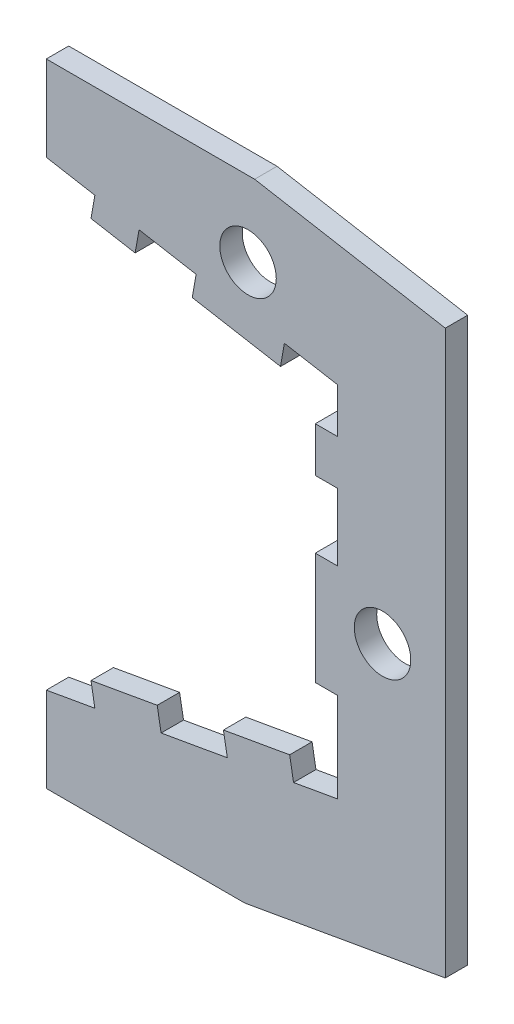
ISO-10303-21;
HEADER;
FILE_DESCRIPTION(('STEP AP214'),'2;1');
FILE_NAME('part.step','',(''),(''),'','','');
FILE_SCHEMA(('AUTOMOTIVE_DESIGN { 1 0 10303 214 1 1 1 1 }'));
ENDSEC;
DATA;
#1=APPLICATION_CONTEXT('core data for automotive mechanical design processes');
#2=APPLICATION_PROTOCOL_DEFINITION('international standard','automotive_design',2000,#1);
#3=PRODUCT_CONTEXT('',#1,'mechanical');
#4=PRODUCT('Part','Part','',(#3));
#5=PRODUCT_RELATED_PRODUCT_CATEGORY('part','',(#4));
#6=PRODUCT_DEFINITION_FORMATION('','',#4);
#7=PRODUCT_DEFINITION_CONTEXT('part definition',#1,'design');
#8=PRODUCT_DEFINITION('design','',#6,#7);
#9=PRODUCT_DEFINITION_SHAPE('','',#8);
#10=(LENGTH_UNIT() NAMED_UNIT(*) SI_UNIT(.MILLI.,.METRE.));
#11=(NAMED_UNIT(*) PLANE_ANGLE_UNIT() SI_UNIT($,.RADIAN.));
#12=(NAMED_UNIT(*) SI_UNIT($,.STERADIAN.) SOLID_ANGLE_UNIT());
#13=UNCERTAINTY_MEASURE_WITH_UNIT(LENGTH_MEASURE(1.E-05),#10,'distance_accuracy_value','');
#14=(GEOMETRIC_REPRESENTATION_CONTEXT(3) GLOBAL_UNCERTAINTY_ASSIGNED_CONTEXT((#13)) GLOBAL_UNIT_ASSIGNED_CONTEXT((#10,
#11,#12)) REPRESENTATION_CONTEXT('',''));
#15=CARTESIAN_POINT('',(0.,0.,0.));
#16=DIRECTION('',(0.,0.,1.));
#17=DIRECTION('',(1.,0.,0.));
#18=AXIS2_PLACEMENT_3D('',#15,#16,#17);
#19=CARTESIAN_POINT('',(-65.,51.4612537460498,5.));
#20=DIRECTION('',(0.173648177666924,0.984807753012209,0.));
#21=DIRECTION('',(-0.984807753012209,0.173648177666924,0.));
#22=AXIS2_PLACEMENT_3D('',#19,#20,#21);
#23=PLANE('',#22);
#24=DIRECTION('',(0.984807753012209,-0.173648177666924,0.));
#25=VECTOR('',#24,1.);
#26=CARTESIAN_POINT('',(-65.,51.4612537460498,5.));
#27=LINE('',#26,#25);
#28=CARTESIAN_POINT('',(-44.3163488855494,47.8141679950116,5.));
#29=VERTEX_POINT('',#28);
#30=CARTESIAN_POINT('',(-31.5845593067913,45.5692099795737,5.));
#31=VERTEX_POINT('',#30);
#32=EDGE_CURVE('E424',#29,#31,#27,.T.);
#33=ORIENTED_EDGE('',*,*,#32,.F.);
#34=DIRECTION('',(0.,0.,1.));
#35=VECTOR('',#34,1.);
#36=CARTESIAN_POINT('',(-44.3163488855494,47.8141679950116,0.));
#37=LINE('',#36,#35);
#38=CARTESIAN_POINT('',(-44.3163488855494,47.8141679950116,0.));
#39=VERTEX_POINT('',#38);
#40=EDGE_CURVE('E474',#39,#29,#37,.T.);
#41=ORIENTED_EDGE('',*,*,#40,.F.);
#42=DIRECTION('',(0.984807753012209,-0.173648177666924,0.));
#43=VECTOR('',#42,1.);
#44=CARTESIAN_POINT('',(-65.,51.4612537460498,0.));
#45=LINE('',#44,#43);
#46=CARTESIAN_POINT('',(-31.5845593067913,45.5692099795737,0.));
#47=VERTEX_POINT('',#46);
#48=EDGE_CURVE('E284',#39,#47,#45,.T.);
#49=ORIENTED_EDGE('',*,*,#48,.T.);
#50=DIRECTION('',(0.,0.,1.));
#51=VECTOR('',#50,1.);
#52=CARTESIAN_POINT('',(-31.5845593067913,45.5692099795737,0.));
#53=LINE('',#52,#51);
#54=EDGE_CURVE('E380',#47,#31,#53,.T.);
#55=ORIENTED_EDGE('',*,*,#54,.T.);
#56=EDGE_LOOP('',(#33,#41,#49,#55));
#57=FACE_BOUND('',#56,.T.);
#58=ADVANCED_FACE('F33',(#57),#23,.F.);
#59=CARTESIAN_POINT('',(-65.,-51.4612537460505,5.));
#60=DIRECTION('',(0.173648177666934,-0.984807753012207,0.));
#61=DIRECTION('',(0.984807753012207,0.173648177666934,0.));
#62=AXIS2_PLACEMENT_3D('',#59,#60,#61);
#63=PLANE('',#62);
#64=DIRECTION('',(-0.984807753012207,-0.173648177666934,0.));
#65=VECTOR('',#64,1.);
#66=CARTESIAN_POINT('',(-65.,-51.4612537460505,5.));
#67=LINE('',#66,#65);
#68=CARTESIAN_POINT('',(-54.1644264156714,-49.5506497716814,5.));
#69=VERTEX_POINT('',#68);
#70=CARTESIAN_POINT('',(-65.,-51.4612537460505,5.));
#71=VERTEX_POINT('',#70);
#72=EDGE_CURVE('E425',#69,#71,#67,.T.);
#73=ORIENTED_EDGE('',*,*,#72,.F.);
#74=DIRECTION('',(0.,0.,1.));
#75=VECTOR('',#74,1.);
#76=CARTESIAN_POINT('',(-54.1644264156714,-49.5506497716814,0.));
#77=LINE('',#76,#75);
#78=CARTESIAN_POINT('',(-54.1644264156714,-49.5506497716814,0.));
#79=VERTEX_POINT('',#78);
#80=EDGE_CURVE('E496',#79,#69,#77,.T.);
#81=ORIENTED_EDGE('',*,*,#80,.F.);
#82=DIRECTION('',(-0.984807753012207,-0.173648177666934,0.));
#83=VECTOR('',#82,1.);
#84=CARTESIAN_POINT('',(-65.,-51.4612537460505,0.));
#85=LINE('',#84,#83);
#86=CARTESIAN_POINT('',(-65.,-51.4612537460505,0.));
#87=VERTEX_POINT('',#86);
#88=EDGE_CURVE('E297',#79,#87,#85,.T.);
#89=ORIENTED_EDGE('',*,*,#88,.T.);
#90=DIRECTION('',(0.,0.,-1.));
#91=VECTOR('',#90,1.);
#92=CARTESIAN_POINT('',(-65.,-51.4612537460505,5.));
#93=LINE('',#92,#91);
#94=EDGE_CURVE('E306',#71,#87,#93,.T.);
#95=ORIENTED_EDGE('',*,*,#94,.F.);
#96=EDGE_LOOP('',(#73,#81,#89,#95));
#97=FACE_BOUND('',#96,.T.);
#98=ADVANCED_FACE('F445',(#97),#63,.F.);
#99=CARTESIAN_POINT('',(0.,-40.,0.));
#100=VERTEX_POINT('',#99);
#101=CARTESIAN_POINT('',(-9.84807753012207,-41.7364817766693,0.));
#102=VERTEX_POINT('',#101);
#103=EDGE_CURVE('E299',#100,#102,#85,.T.);
#104=ORIENTED_EDGE('',*,*,#103,.T.);
#105=DIRECTION('',(0.,0.,1.));
#106=VECTOR('',#105,1.);
#107=CARTESIAN_POINT('',(-9.84807753012207,-41.7364817766693,0.));
#108=LINE('',#107,#106);
#109=CARTESIAN_POINT('',(-9.84807753012207,-41.7364817766693,5.));
#110=VERTEX_POINT('',#109);
#111=EDGE_CURVE('E347',#102,#110,#108,.T.);
#112=ORIENTED_EDGE('',*,*,#111,.T.);
#113=CARTESIAN_POINT('',(0.,-40.,5.));
#114=VERTEX_POINT('',#113);
#115=EDGE_CURVE('E427',#114,#110,#67,.T.);
#116=ORIENTED_EDGE('',*,*,#115,.F.);
#117=DIRECTION('',(0.,0.,-1.));
#118=VECTOR('',#117,1.);
#119=CARTESIAN_POINT('',(0.,-40.,5.));
#120=LINE('',#119,#118);
#121=EDGE_CURVE('E309',#114,#100,#120,.T.);
#122=ORIENTED_EDGE('',*,*,#121,.T.);
#123=EDGE_LOOP('',(#104,#112,#116,#122));
#124=FACE_BOUND('',#123,.T.);
#125=ADVANCED_FACE('F630',(#124),#63,.F.);
#126=CARTESIAN_POINT('',(0.,40.,5.));
#127=DIRECTION('',(1.,0.,0.));
#128=DIRECTION('',(0.,0.,-1.));
#129=AXIS2_PLACEMENT_3D('',#126,#127,#128);
#130=PLANE('',#129);
#131=DIRECTION('',(0.,-1.,0.));
#132=VECTOR('',#131,1.);
#133=CARTESIAN_POINT('',(0.,40.,5.));
#134=LINE('',#133,#132);
#135=CARTESIAN_POINT('',(0.,20.,5.));
#136=VERTEX_POINT('',#135);
#137=CARTESIAN_POINT('',(0.,5.,5.));
#138=VERTEX_POINT('',#137);
#139=EDGE_CURVE('E426',#136,#138,#134,.T.);
#140=ORIENTED_EDGE('',*,*,#139,.F.);
#141=DIRECTION('',(0.,0.,1.));
#142=VECTOR('',#141,1.);
#143=CARTESIAN_POINT('',(0.,20.,0.));
#144=LINE('',#143,#142);
#145=CARTESIAN_POINT('',(0.,20.,0.));
#146=VERTEX_POINT('',#145);
#147=EDGE_CURVE('E350',#146,#136,#144,.T.);
#148=ORIENTED_EDGE('',*,*,#147,.F.);
#149=DIRECTION('',(0.,-1.,0.));
#150=VECTOR('',#149,1.);
#151=CARTESIAN_POINT('',(0.,40.,0.));
#152=LINE('',#151,#150);
#153=CARTESIAN_POINT('',(0.,5.,0.));
#154=VERTEX_POINT('',#153);
#155=EDGE_CURVE('E298',#146,#154,#152,.T.);
#156=ORIENTED_EDGE('',*,*,#155,.T.);
#157=DIRECTION('',(0.,0.,1.));
#158=VECTOR('',#157,1.);
#159=CARTESIAN_POINT('',(0.,5.,0.));
#160=LINE('',#159,#158);
#161=EDGE_CURVE('E394',#154,#138,#160,.T.);
#162=ORIENTED_EDGE('',*,*,#161,.T.);
#163=EDGE_LOOP('',(#140,#148,#156,#162));
#164=FACE_BOUND('',#163,.T.);
#165=ADVANCED_FACE('F635',(#164),#130,.F.);
#166=CARTESIAN_POINT('',(-11.8884042465471,42.0962464262353,5.));
#167=VERTEX_POINT('',#166);
#168=CARTESIAN_POINT('',(0.,40.,5.));
#169=VERTEX_POINT('',#168);
#170=EDGE_CURVE('E419',#167,#169,#27,.T.);
#171=ORIENTED_EDGE('',*,*,#170,.F.);
#172=DIRECTION('',(0.,0.,1.));
#173=VECTOR('',#172,1.);
#174=CARTESIAN_POINT('',(-11.8884042465471,42.0962464262353,0.));
#175=LINE('',#174,#173);
#176=CARTESIAN_POINT('',(-11.8884042465471,42.0962464262353,0.));
#177=VERTEX_POINT('',#176);
#178=EDGE_CURVE('E368',#177,#167,#175,.T.);
#179=ORIENTED_EDGE('',*,*,#178,.F.);
#180=CARTESIAN_POINT('',(0.,40.,0.));
#181=VERTEX_POINT('',#180);
#182=EDGE_CURVE('E281',#177,#181,#45,.T.);
#183=ORIENTED_EDGE('',*,*,#182,.T.);
#184=DIRECTION('',(0.,0.,-1.));
#185=VECTOR('',#184,1.);
#186=CARTESIAN_POINT('',(0.,40.,5.));
#187=LINE('',#186,#185);
#188=EDGE_CURVE('E41',#169,#181,#187,.T.);
#189=ORIENTED_EDGE('',*,*,#188,.F.);
#190=EDGE_LOOP('',(#171,#179,#183,#189));
#191=FACE_BOUND('',#190,.T.);
#192=ADVANCED_FACE('F604',(#191),#23,.F.);
#193=CARTESIAN_POINT('',(0.,-20.,5.));
#194=VERTEX_POINT('',#193);
#195=EDGE_CURVE('E423',#194,#114,#134,.T.);
#196=ORIENTED_EDGE('',*,*,#195,.F.);
#197=DIRECTION('',(0.,0.,1.));
#198=VECTOR('',#197,1.);
#199=CARTESIAN_POINT('',(0.,-20.,0.));
#200=LINE('',#199,#198);
#201=CARTESIAN_POINT('',(0.,-20.,0.));
#202=VERTEX_POINT('',#201);
#203=EDGE_CURVE('E401',#202,#194,#200,.T.);
#204=ORIENTED_EDGE('',*,*,#203,.F.);
#205=EDGE_CURVE('E293',#202,#100,#152,.T.);
#206=ORIENTED_EDGE('',*,*,#205,.T.);
#207=ORIENTED_EDGE('',*,*,#121,.F.);
#208=EDGE_LOOP('',(#196,#204,#206,#207));
#209=FACE_BOUND('',#208,.T.);
#210=ADVANCED_FACE('F634',(#209),#130,.F.);
#211=CARTESIAN_POINT('',(0.,0.,5.));
#212=DIRECTION('',(0.,0.,1.));
#213=DIRECTION('',(1.,0.,0.));
#214=AXIS2_PLACEMENT_3D('',#211,#212,#213);
#215=PLANE('',#214);
#216=DIRECTION('',(-1.,0.,0.));
#217=VECTOR('',#216,1.);
#218=CARTESIAN_POINT('',(-20.713388405461,-70.4612537460498,5.));
#219=LINE('',#218,#217);
#220=CARTESIAN_POINT('',(-20.713388405461,-70.4612537460498,5.));
#221=VERTEX_POINT('',#220);
#222=CARTESIAN_POINT('',(-65.,-70.4612537460498,5.));
#223=VERTEX_POINT('',#222);
#224=EDGE_CURVE('E48',#221,#223,#219,.T.);
#225=ORIENTED_EDGE('',*,*,#224,.F.);
#226=DIRECTION('',(-0.984807753012207,-0.173648177666934,0.));
#227=VECTOR('',#226,1.);
#228=CARTESIAN_POINT('',(24.,-62.5770769712698,5.));
#229=LINE('',#228,#227);
#230=CARTESIAN_POINT('',(24.,-62.5770769712698,5.));
#231=VERTEX_POINT('',#230);
#232=EDGE_CURVE('E572',#231,#221,#229,.T.);
#233=ORIENTED_EDGE('',*,*,#232,.F.);
#234=DIRECTION('',(0.,-1.,0.));
#235=VECTOR('',#234,1.);
#236=CARTESIAN_POINT('',(24.,62.9617320536433,5.));
#237=LINE('',#236,#235);
#238=CARTESIAN_POINT('',(24.,62.9617320536433,5.));
#239=VERTEX_POINT('',#238);
#240=EDGE_CURVE('E570',#239,#231,#237,.T.);
#241=ORIENTED_EDGE('',*,*,#240,.F.);
#242=DIRECTION('',(0.984807753012209,-0.173648177666927,0.));
#243=VECTOR('',#242,1.);
#244=CARTESIAN_POINT('',(-18.5319010299744,70.4612537460498,5.));
#245=LINE('',#244,#243);
#246=CARTESIAN_POINT('',(-18.5319010299744,70.4612537460498,5.));
#247=VERTEX_POINT('',#246);
#248=EDGE_CURVE('E567',#247,#239,#245,.T.);
#249=ORIENTED_EDGE('',*,*,#248,.F.);
#250=DIRECTION('',(1.,0.,0.));
#251=VECTOR('',#250,1.);
#252=CARTESIAN_POINT('',(-65.,70.4612537460498,5.));
#253=LINE('',#252,#251);
#254=CARTESIAN_POINT('',(-65.,70.4612537460498,5.));
#255=VERTEX_POINT('',#254);
#256=EDGE_CURVE('E565',#255,#247,#253,.T.);
#257=ORIENTED_EDGE('',*,*,#256,.F.);
#258=DIRECTION('',(0.,-1.,0.));
#259=VECTOR('',#258,1.);
#260=CARTESIAN_POINT('',(-65.,71.4612537460498,5.));
#261=LINE('',#260,#259);
#262=CARTESIAN_POINT('',(-65.,51.4612537460498,5.));
#263=VERTEX_POINT('',#262);
#264=EDGE_CURVE('E272',#255,#263,#261,.T.);
#265=ORIENTED_EDGE('',*,*,#264,.T.);
#266=CARTESIAN_POINT('',(-54.1644264156715,49.5506497716808,5.));
#267=VERTEX_POINT('',#266);
#268=EDGE_CURVE('E420',#263,#267,#27,.T.);
#269=ORIENTED_EDGE('',*,*,#268,.T.);
#270=DIRECTION('',(-0.173648177666924,-0.984807753012209,0.));
#271=VECTOR('',#270,1.);
#272=CARTESIAN_POINT('',(-54.1644264156715,49.5506497716808,5.));
#273=LINE('',#272,#271);
#274=CARTESIAN_POINT('',(-55.0326673040061,44.6266110066198,5.));
#275=VERTEX_POINT('',#274);
#276=EDGE_CURVE('E455',#267,#275,#273,.T.);
#277=ORIENTED_EDGE('',*,*,#276,.T.);
#278=DIRECTION('',(0.984807753012209,-0.173648177666923,0.));
#279=VECTOR('',#278,1.);
#280=CARTESIAN_POINT('',(-45.184589773884,42.8901292299505,5.));
#281=LINE('',#280,#279);
#282=CARTESIAN_POINT('',(-45.184589773884,42.8901292299505,5.));
#283=VERTEX_POINT('',#282);
#284=EDGE_CURVE('E469',#275,#283,#281,.T.);
#285=ORIENTED_EDGE('',*,*,#284,.T.);
#286=DIRECTION('',(0.173648177666924,0.984807753012209,0.));
#287=VECTOR('',#286,1.);
#288=CARTESIAN_POINT('',(-44.3163488855494,47.8141679950116,5.));
#289=LINE('',#288,#287);
#290=EDGE_CURVE('E56',#283,#29,#289,.T.);
#291=ORIENTED_EDGE('',*,*,#290,.T.);
#292=ORIENTED_EDGE('',*,*,#32,.T.);
#293=DIRECTION('',(-0.173648177666924,-0.984807753012209,0.));
#294=VECTOR('',#293,1.);
#295=CARTESIAN_POINT('',(-31.5845593067913,45.5692099795737,5.));
#296=LINE('',#295,#294);
#297=CARTESIAN_POINT('',(-32.4528001951259,40.6451712145127,5.));
#298=VERTEX_POINT('',#297);
#299=EDGE_CURVE('E370',#31,#298,#296,.T.);
#300=ORIENTED_EDGE('',*,*,#299,.T.);
#301=DIRECTION('',(0.984807753012209,-0.173648177666923,0.));
#302=VECTOR('',#301,1.);
#303=CARTESIAN_POINT('',(-12.7566451348818,37.1722076611742,5.));
#304=LINE('',#303,#302);
#305=CARTESIAN_POINT('',(-12.7566451348818,37.1722076611742,5.));
#306=VERTEX_POINT('',#305);
#307=EDGE_CURVE('E362',#298,#306,#304,.T.);
#308=ORIENTED_EDGE('',*,*,#307,.T.);
#309=DIRECTION('',(0.173648177666923,0.984807753012209,0.));
#310=VECTOR('',#309,1.);
#311=CARTESIAN_POINT('',(-11.8884042465471,42.0962464262353,5.));
#312=LINE('',#311,#310);
#313=EDGE_CURVE('E353',#306,#167,#312,.T.);
#314=ORIENTED_EDGE('',*,*,#313,.T.);
#315=ORIENTED_EDGE('',*,*,#170,.T.);
#316=CARTESIAN_POINT('',(0.,30.,5.));
#317=VERTEX_POINT('',#316);
#318=EDGE_CURVE('E319',#169,#317,#134,.T.);
#319=ORIENTED_EDGE('',*,*,#318,.T.);
#320=DIRECTION('',(-1.,0.,0.));
#321=VECTOR('',#320,1.);
#322=CARTESIAN_POINT('',(0.,30.,5.));
#323=LINE('',#322,#321);
#324=CARTESIAN_POINT('',(-5.00000000000001,30.,5.));
#325=VERTEX_POINT('',#324);
#326=EDGE_CURVE('E344',#317,#325,#323,.T.);
#327=ORIENTED_EDGE('',*,*,#326,.T.);
#328=DIRECTION('',(0.,-1.,0.));
#329=VECTOR('',#328,1.);
#330=CARTESIAN_POINT('',(-5.00000000000001,30.,5.));
#331=LINE('',#330,#329);
#332=CARTESIAN_POINT('',(-5.00000000000001,20.,5.));
#333=VERTEX_POINT('',#332);
#334=EDGE_CURVE('E336',#325,#333,#331,.T.);
#335=ORIENTED_EDGE('',*,*,#334,.T.);
#336=DIRECTION('',(1.,0.,0.));
#337=VECTOR('',#336,1.);
#338=CARTESIAN_POINT('',(0.,20.,5.));
#339=LINE('',#338,#337);
#340=EDGE_CURVE('E332',#333,#136,#339,.T.);
#341=ORIENTED_EDGE('',*,*,#340,.T.);
#342=ORIENTED_EDGE('',*,*,#139,.T.);
#343=DIRECTION('',(-1.,0.,0.));
#344=VECTOR('',#343,1.);
#345=CARTESIAN_POINT('',(0.,5.,5.));
#346=LINE('',#345,#344);
#347=CARTESIAN_POINT('',(-5.,5.,5.));
#348=VERTEX_POINT('',#347);
#349=EDGE_CURVE('E377',#138,#348,#346,.T.);
#350=ORIENTED_EDGE('',*,*,#349,.T.);
#351=DIRECTION('',(0.,-1.,0.));
#352=VECTOR('',#351,1.);
#353=CARTESIAN_POINT('',(-5.,5.,5.));
#354=LINE('',#353,#352);
#355=CARTESIAN_POINT('',(-5.,-20.,5.));
#356=VERTEX_POINT('',#355);
#357=EDGE_CURVE('E397',#348,#356,#354,.T.);
#358=ORIENTED_EDGE('',*,*,#357,.T.);
#359=DIRECTION('',(1.,0.,0.));
#360=VECTOR('',#359,1.);
#361=CARTESIAN_POINT('',(0.,-20.,5.));
#362=LINE('',#361,#360);
#363=EDGE_CURVE('E389',#356,#194,#362,.T.);
#364=ORIENTED_EDGE('',*,*,#363,.T.);
#365=ORIENTED_EDGE('',*,*,#195,.T.);
#366=ORIENTED_EDGE('',*,*,#115,.T.);
#367=DIRECTION('',(-0.173648177666935,0.984807753012207,0.));
#368=VECTOR('',#367,1.);
#369=CARTESIAN_POINT('',(-9.84807753012207,-41.7364817766693,5.));
#370=LINE('',#369,#368);
#371=CARTESIAN_POINT('',(-10.7163184184567,-36.8124430116083,5.));
#372=VERTEX_POINT('',#371);
#373=EDGE_CURVE('E504',#110,#372,#370,.T.);
#374=ORIENTED_EDGE('',*,*,#373,.T.);
#375=DIRECTION('',(-0.984807753012207,-0.173648177666934,0.));
#376=VECTOR('',#375,1.);
#377=CARTESIAN_POINT('',(-10.7163184184567,-36.8124430116083,5.));
#378=LINE('',#377,#376);
#379=CARTESIAN_POINT('',(-25.4884347136398,-39.4171656766123,5.));
#380=VERTEX_POINT('',#379);
#381=EDGE_CURVE('E521',#372,#380,#378,.T.);
#382=ORIENTED_EDGE('',*,*,#381,.T.);
#383=DIRECTION('',(0.173648177666934,-0.984807753012207,0.));
#384=VECTOR('',#383,1.);
#385=CARTESIAN_POINT('',(-24.6201938253052,-44.3412044416733,5.));
#386=LINE('',#385,#384);
#387=CARTESIAN_POINT('',(-24.6201938253052,-44.3412044416734,5.));
#388=VERTEX_POINT('',#387);
#389=EDGE_CURVE('E515',#380,#388,#386,.T.);
#390=ORIENTED_EDGE('',*,*,#389,.T.);
#391=CARTESIAN_POINT('',(-39.3923101204883,-46.9459271066774,5.));
#392=VERTEX_POINT('',#391);
#393=EDGE_CURVE('E429',#388,#392,#67,.T.);
#394=ORIENTED_EDGE('',*,*,#393,.T.);
#395=DIRECTION('',(-0.173648177666934,0.984807753012207,0.));
#396=VECTOR('',#395,1.);
#397=CARTESIAN_POINT('',(-39.3923101204883,-46.9459271066774,5.));
#398=LINE('',#397,#396);
#399=CARTESIAN_POINT('',(-40.260551008823,-42.0218883416163,5.));
#400=VERTEX_POINT('',#399);
#401=EDGE_CURVE('E498',#392,#400,#398,.T.);
#402=ORIENTED_EDGE('',*,*,#401,.T.);
#403=DIRECTION('',(-0.984807753012207,-0.173648177666934,0.));
#404=VECTOR('',#403,1.);
#405=CARTESIAN_POINT('',(-55.0326673040061,-44.6266110066203,5.));
#406=LINE('',#405,#404);
#407=CARTESIAN_POINT('',(-55.0326673040061,-44.6266110066203,5.));
#408=VERTEX_POINT('',#407);
#409=EDGE_CURVE('E490',#400,#408,#406,.T.);
#410=ORIENTED_EDGE('',*,*,#409,.T.);
#411=DIRECTION('',(0.173648177666934,-0.984807753012207,0.));
#412=VECTOR('',#411,1.);
#413=CARTESIAN_POINT('',(-54.1644264156714,-49.5506497716814,5.));
#414=LINE('',#413,#412);
#415=EDGE_CURVE('E441',#408,#69,#414,.T.);
#416=ORIENTED_EDGE('',*,*,#415,.T.);
#417=ORIENTED_EDGE('',*,*,#72,.T.);
#418=DIRECTION('',(0.,-1.,0.));
#419=VECTOR('',#418,1.);
#420=CARTESIAN_POINT('',(-65.,-51.4612537460505,5.));
#421=LINE('',#420,#419);
#422=EDGE_CURVE('E290',#71,#223,#421,.T.);
#423=ORIENTED_EDGE('',*,*,#422,.T.);
#424=EDGE_LOOP('',(#225,#233,#241,#249,#257,#265,#269,#277,#285,#291,#292,#300,#308,#314,#315,
#319,#327,#335,#341,#342,#350,#358,#364,#365,#366,#374,#382,#390,#394,#402,#410,#416,#417,#423));
#425=FACE_BOUND('',#424,.T.);
#426=CARTESIAN_POINT('',(-20.,53.6808057330266,5.));
#427=DIRECTION('',(0.,0.,1.));
#428=DIRECTION('',(1.,0.,0.));
#429=AXIS2_PLACEMENT_3D('',#426,#427,#428);
#430=CIRCLE('',#429,6.30000000000009);
#431=CARTESIAN_POINT('',(-13.6999999999999,53.6808057330266,5.));
#432=VERTEX_POINT('',#431);
#433=EDGE_CURVE('E282',#432,#432,#430,.T.);
#434=ORIENTED_EDGE('',*,*,#433,.F.);
#435=EDGE_LOOP('',(#434));
#436=FACE_BOUND('',#435,.T.);
#437=CARTESIAN_POINT('',(10.,-5.,5.));
#438=DIRECTION('',(0.,0.,1.));
#439=DIRECTION('',(-1.,0.,0.));
#440=AXIS2_PLACEMENT_3D('',#437,#438,#439);
#441=CIRCLE('',#440,6.30000000000009);
#442=CARTESIAN_POINT('',(3.69999999999992,-5.,5.));
#443=VERTEX_POINT('',#442);
#444=EDGE_CURVE('E411',#443,#443,#441,.T.);
#445=ORIENTED_EDGE('',*,*,#444,.F.);
#446=EDGE_LOOP('',(#445));
#447=FACE_BOUND('',#446,.T.);
#448=ADVANCED_FACE('F436',(#425,#436,#447),#215,.T.);
#449=CARTESIAN_POINT('',(0.,0.,0.));
#450=DIRECTION('',(0.,0.,1.));
#451=DIRECTION('',(1.,0.,0.));
#452=AXIS2_PLACEMENT_3D('',#449,#450,#451);
#453=PLANE('',#452);
#454=CARTESIAN_POINT('',(-20.,53.6808057330266,0.));
#455=DIRECTION('',(0.,0.,1.));
#456=DIRECTION('',(1.,0.,0.));
#457=AXIS2_PLACEMENT_3D('',#454,#455,#456);
#458=CIRCLE('',#457,6.30000000000009);
#459=CARTESIAN_POINT('',(-13.6999999999999,53.6808057330266,0.));
#460=VERTEX_POINT('',#459);
#461=EDGE_CURVE('E287',#460,#460,#458,.T.);
#462=ORIENTED_EDGE('',*,*,#461,.T.);
#463=EDGE_LOOP('',(#462));
#464=FACE_BOUND('',#463,.T.);
#465=DIRECTION('',(-0.984807753012207,-0.173648177666934,0.));
#466=VECTOR('',#465,1.);
#467=CARTESIAN_POINT('',(24.,-62.5770769712698,0.));
#468=LINE('',#467,#466);
#469=CARTESIAN_POINT('',(24.,-62.5770769712698,0.));
#470=VERTEX_POINT('',#469);
#471=CARTESIAN_POINT('',(-20.713388405461,-70.4612537460498,0.));
#472=VERTEX_POINT('',#471);
#473=EDGE_CURVE('E559',#470,#472,#468,.T.);
#474=ORIENTED_EDGE('',*,*,#473,.T.);
#475=DIRECTION('',(-1.,0.,0.));
#476=VECTOR('',#475,1.);
#477=CARTESIAN_POINT('',(-20.713388405461,-70.4612537460498,0.));
#478=LINE('',#477,#476);
#479=CARTESIAN_POINT('',(-65.,-70.4612537460498,0.));
#480=VERTEX_POINT('',#479);
#481=EDGE_CURVE('E273',#472,#480,#478,.T.);
#482=ORIENTED_EDGE('',*,*,#481,.T.);
#483=DIRECTION('',(0.,-1.,0.));
#484=VECTOR('',#483,1.);
#485=CARTESIAN_POINT('',(-65.,-51.4612537460505,0.));
#486=LINE('',#485,#484);
#487=EDGE_CURVE('E302',#87,#480,#486,.T.);
#488=ORIENTED_EDGE('',*,*,#487,.F.);
#489=ORIENTED_EDGE('',*,*,#88,.F.);
#490=DIRECTION('',(0.173648177666934,-0.984807753012207,0.));
#491=VECTOR('',#490,1.);
#492=CARTESIAN_POINT('',(-54.1644264156714,-49.5506497716814,0.));
#493=LINE('',#492,#491);
#494=CARTESIAN_POINT('',(-55.0326673040061,-44.6266110066203,0.));
#495=VERTEX_POINT('',#494);
#496=EDGE_CURVE('E487',#495,#79,#493,.T.);
#497=ORIENTED_EDGE('',*,*,#496,.F.);
#498=DIRECTION('',(-0.984807753012207,-0.173648177666934,0.));
#499=VECTOR('',#498,1.);
#500=CARTESIAN_POINT('',(-55.0326673040061,-44.6266110066203,0.));
#501=LINE('',#500,#499);
#502=CARTESIAN_POINT('',(-40.260551008823,-42.0218883416163,0.));
#503=VERTEX_POINT('',#502);
#504=EDGE_CURVE('E493',#503,#495,#501,.T.);
#505=ORIENTED_EDGE('',*,*,#504,.F.);
#506=DIRECTION('',(-0.173648177666934,0.984807753012207,0.));
#507=VECTOR('',#506,1.);
#508=CARTESIAN_POINT('',(-39.3923101204883,-46.9459271066774,0.));
#509=LINE('',#508,#507);
#510=CARTESIAN_POINT('',(-39.3923101204883,-46.9459271066774,0.));
#511=VERTEX_POINT('',#510);
#512=EDGE_CURVE('E489',#511,#503,#509,.T.);
#513=ORIENTED_EDGE('',*,*,#512,.F.);
#514=CARTESIAN_POINT('',(-24.6201938253052,-44.3412044416733,0.));
#515=VERTEX_POINT('',#514);
#516=EDGE_CURVE('E303',#515,#511,#85,.T.);
#517=ORIENTED_EDGE('',*,*,#516,.F.);
#518=DIRECTION('',(0.173648177666934,-0.984807753012207,0.));
#519=VECTOR('',#518,1.);
#520=CARTESIAN_POINT('',(-24.6201938253052,-44.3412044416733,0.));
#521=LINE('',#520,#519);
#522=CARTESIAN_POINT('',(-25.4884347136398,-39.4171656766123,0.));
#523=VERTEX_POINT('',#522);
#524=EDGE_CURVE('E518',#523,#515,#521,.T.);
#525=ORIENTED_EDGE('',*,*,#524,.F.);
#526=DIRECTION('',(-0.984807753012207,-0.173648177666934,0.));
#527=VECTOR('',#526,1.);
#528=CARTESIAN_POINT('',(-10.7163184184567,-36.8124430116083,0.));
#529=LINE('',#528,#527);
#530=CARTESIAN_POINT('',(-10.7163184184567,-36.8124430116083,0.));
#531=VERTEX_POINT('',#530);
#532=EDGE_CURVE('E514',#531,#523,#529,.T.);
#533=ORIENTED_EDGE('',*,*,#532,.F.);
#534=DIRECTION('',(-0.173648177666935,0.984807753012207,0.));
#535=VECTOR('',#534,1.);
#536=CARTESIAN_POINT('',(-9.84807753012207,-41.7364817766693,0.));
#537=LINE('',#536,#535);
#538=EDGE_CURVE('E511',#102,#531,#537,.T.);
#539=ORIENTED_EDGE('',*,*,#538,.F.);
#540=ORIENTED_EDGE('',*,*,#103,.F.);
#541=ORIENTED_EDGE('',*,*,#205,.F.);
#542=DIRECTION('',(1.,0.,0.));
#543=VECTOR('',#542,1.);
#544=CARTESIAN_POINT('',(0.,-20.,0.));
#545=LINE('',#544,#543);
#546=CARTESIAN_POINT('',(-5.,-20.,0.));
#547=VERTEX_POINT('',#546);
#548=EDGE_CURVE('E392',#547,#202,#545,.T.);
#549=ORIENTED_EDGE('',*,*,#548,.F.);
#550=DIRECTION('',(0.,-1.,0.));
#551=VECTOR('',#550,1.);
#552=CARTESIAN_POINT('',(-5.,5.,0.));
#553=LINE('',#552,#551);
#554=CARTESIAN_POINT('',(-5.,5.,0.));
#555=VERTEX_POINT('',#554);
#556=EDGE_CURVE('E388',#555,#547,#553,.T.);
#557=ORIENTED_EDGE('',*,*,#556,.F.);
#558=DIRECTION('',(-1.,0.,0.));
#559=VECTOR('',#558,1.);
#560=CARTESIAN_POINT('',(0.,5.,0.));
#561=LINE('',#560,#559);
#562=EDGE_CURVE('E385',#154,#555,#561,.T.);
#563=ORIENTED_EDGE('',*,*,#562,.F.);
#564=ORIENTED_EDGE('',*,*,#155,.F.);
#565=DIRECTION('',(1.,0.,0.));
#566=VECTOR('',#565,1.);
#567=CARTESIAN_POINT('',(0.,20.,0.));
#568=LINE('',#567,#566);
#569=CARTESIAN_POINT('',(-5.00000000000001,20.,0.));
#570=VERTEX_POINT('',#569);
#571=EDGE_CURVE('E334',#570,#146,#568,.T.);
#572=ORIENTED_EDGE('',*,*,#571,.F.);
#573=DIRECTION('',(0.,-1.,0.));
#574=VECTOR('',#573,1.);
#575=CARTESIAN_POINT('',(-5.00000000000001,30.,0.));
#576=LINE('',#575,#574);
#577=CARTESIAN_POINT('',(-5.00000000000001,30.,0.));
#578=VERTEX_POINT('',#577);
#579=EDGE_CURVE('E330',#578,#570,#576,.T.);
#580=ORIENTED_EDGE('',*,*,#579,.F.);
#581=DIRECTION('',(-1.,0.,0.));
#582=VECTOR('',#581,1.);
#583=CARTESIAN_POINT('',(0.,30.,0.));
#584=LINE('',#583,#582);
#585=CARTESIAN_POINT('',(0.,30.,0.));
#586=VERTEX_POINT('',#585);
#587=EDGE_CURVE('E327',#586,#578,#584,.T.);
#588=ORIENTED_EDGE('',*,*,#587,.F.);
#589=EDGE_CURVE('E294',#181,#586,#152,.T.);
#590=ORIENTED_EDGE('',*,*,#589,.F.);
#591=ORIENTED_EDGE('',*,*,#182,.F.);
#592=DIRECTION('',(0.173648177666923,0.984807753012209,0.));
#593=VECTOR('',#592,1.);
#594=CARTESIAN_POINT('',(-11.8884042465471,42.0962464262353,0.));
#595=LINE('',#594,#593);
#596=CARTESIAN_POINT('',(-12.7566451348818,37.1722076611742,0.));
#597=VERTEX_POINT('',#596);
#598=EDGE_CURVE('E359',#597,#177,#595,.T.);
#599=ORIENTED_EDGE('',*,*,#598,.F.);
#600=DIRECTION('',(0.984807753012209,-0.173648177666923,0.));
#601=VECTOR('',#600,1.);
#602=CARTESIAN_POINT('',(-12.7566451348818,37.1722076611742,0.));
#603=LINE('',#602,#601);
#604=CARTESIAN_POINT('',(-32.4528001951259,40.6451712145127,0.));
#605=VERTEX_POINT('',#604);
#606=EDGE_CURVE('E365',#605,#597,#603,.T.);
#607=ORIENTED_EDGE('',*,*,#606,.F.);
#608=DIRECTION('',(-0.173648177666924,-0.984807753012209,0.));
#609=VECTOR('',#608,1.);
#610=CARTESIAN_POINT('',(-31.5845593067913,45.5692099795737,0.));
#611=LINE('',#610,#609);
#612=EDGE_CURVE('E361',#47,#605,#611,.T.);
#613=ORIENTED_EDGE('',*,*,#612,.F.);
#614=ORIENTED_EDGE('',*,*,#48,.F.);
#615=DIRECTION('',(0.173648177666924,0.984807753012209,0.));
#616=VECTOR('',#615,1.);
#617=CARTESIAN_POINT('',(-44.3163488855494,47.8141679950116,0.));
#618=LINE('',#617,#616);
#619=CARTESIAN_POINT('',(-45.184589773884,42.8901292299505,0.));
#620=VERTEX_POINT('',#619);
#621=EDGE_CURVE('E466',#620,#39,#618,.T.);
#622=ORIENTED_EDGE('',*,*,#621,.F.);
#623=DIRECTION('',(0.984807753012209,-0.173648177666923,0.));
#624=VECTOR('',#623,1.);
#625=CARTESIAN_POINT('',(-45.184589773884,42.8901292299505,0.));
#626=LINE('',#625,#624);
#627=CARTESIAN_POINT('',(-55.0326673040061,44.6266110066198,0.));
#628=VERTEX_POINT('',#627);
#629=EDGE_CURVE('E472',#628,#620,#626,.T.);
#630=ORIENTED_EDGE('',*,*,#629,.F.);
#631=DIRECTION('',(-0.173648177666924,-0.984807753012209,0.));
#632=VECTOR('',#631,1.);
#633=CARTESIAN_POINT('',(-54.1644264156715,49.5506497716808,0.));
#634=LINE('',#633,#632);
#635=CARTESIAN_POINT('',(-54.1644264156715,49.5506497716808,0.));
#636=VERTEX_POINT('',#635);
#637=EDGE_CURVE('E468',#636,#628,#634,.T.);
#638=ORIENTED_EDGE('',*,*,#637,.F.);
#639=CARTESIAN_POINT('',(-65.,51.4612537460498,0.));
#640=VERTEX_POINT('',#639);
#641=EDGE_CURVE('E280',#640,#636,#45,.T.);
#642=ORIENTED_EDGE('',*,*,#641,.F.);
#643=DIRECTION('',(0.,-1.,0.));
#644=VECTOR('',#643,1.);
#645=CARTESIAN_POINT('',(-65.,71.4612537460498,0.));
#646=LINE('',#645,#644);
#647=CARTESIAN_POINT('',(-65.,70.4612537460498,0.));
#648=VERTEX_POINT('',#647);
#649=EDGE_CURVE('E270',#648,#640,#646,.T.);
#650=ORIENTED_EDGE('',*,*,#649,.F.);
#651=DIRECTION('',(1.,0.,0.));
#652=VECTOR('',#651,1.);
#653=CARTESIAN_POINT('',(-65.,70.4612537460498,0.));
#654=LINE('',#653,#652);
#655=CARTESIAN_POINT('',(-18.5319010299744,70.4612537460498,0.));
#656=VERTEX_POINT('',#655);
#657=EDGE_CURVE('E254',#648,#656,#654,.T.);
#658=ORIENTED_EDGE('',*,*,#657,.T.);
#659=DIRECTION('',(0.984807753012209,-0.173648177666927,0.));
#660=VECTOR('',#659,1.);
#661=CARTESIAN_POINT('',(-18.5319010299744,70.4612537460498,0.));
#662=LINE('',#661,#660);
#663=CARTESIAN_POINT('',(24.,62.9617320536433,0.));
#664=VERTEX_POINT('',#663);
#665=EDGE_CURVE('E265',#656,#664,#662,.T.);
#666=ORIENTED_EDGE('',*,*,#665,.T.);
#667=DIRECTION('',(0.,-1.,0.));
#668=VECTOR('',#667,1.);
#669=CARTESIAN_POINT('',(24.,62.9617320536433,0.));
#670=LINE('',#669,#668);
#671=EDGE_CURVE('E561',#664,#470,#670,.T.);
#672=ORIENTED_EDGE('',*,*,#671,.T.);
#673=EDGE_LOOP('',(#474,#482,#488,#489,#497,#505,#513,#517,#525,#533,#539,#540,#541,#549,#557,
#563,#564,#572,#580,#588,#590,#591,#599,#607,#613,#614,#622,#630,#638,#642,#650,#658,#666,#672));
#674=FACE_BOUND('',#673,.T.);
#675=CARTESIAN_POINT('',(10.,-5.,0.));
#676=DIRECTION('',(0.,0.,1.));
#677=DIRECTION('',(-1.,0.,0.));
#678=AXIS2_PLACEMENT_3D('',#675,#676,#677);
#679=CIRCLE('',#678,6.30000000000009);
#680=CARTESIAN_POINT('',(3.69999999999992,-5.,0.));
#681=VERTEX_POINT('',#680);
#682=EDGE_CURVE('E404',#681,#681,#679,.T.);
#683=ORIENTED_EDGE('',*,*,#682,.T.);
#684=EDGE_LOOP('',(#683));
#685=FACE_BOUND('',#684,.T.);
#686=ADVANCED_FACE('F276',(#464,#674,#685),#453,.F.);
#687=CARTESIAN_POINT('',(-65.,71.4612537460498,5.));
#688=DIRECTION('',(1.,0.,0.));
#689=DIRECTION('',(0.,1.,0.));
#690=AXIS2_PLACEMENT_3D('',#687,#688,#689);
#691=PLANE('',#690);
#692=ORIENTED_EDGE('',*,*,#264,.F.);
#693=DIRECTION('',(0.,0.,1.));
#694=VECTOR('',#693,1.);
#695=CARTESIAN_POINT('',(-65.,70.4612537460498,0.));
#696=LINE('',#695,#694);
#697=EDGE_CURVE('E258',#648,#255,#696,.T.);
#698=ORIENTED_EDGE('',*,*,#697,.F.);
#699=ORIENTED_EDGE('',*,*,#649,.T.);
#700=DIRECTION('',(0.,0.,-1.));
#701=VECTOR('',#700,1.);
#702=CARTESIAN_POINT('',(-65.,51.4612537460498,5.));
#703=LINE('',#702,#701);
#704=EDGE_CURVE('E11',#263,#640,#703,.T.);
#705=ORIENTED_EDGE('',*,*,#704,.F.);
#706=EDGE_LOOP('',(#692,#698,#699,#705));
#707=FACE_BOUND('',#706,.T.);
#708=ADVANCED_FACE('F35',(#707),#691,.F.);
#709=ORIENTED_EDGE('',*,*,#641,.T.);
#710=DIRECTION('',(0.,0.,1.));
#711=VECTOR('',#710,1.);
#712=CARTESIAN_POINT('',(-54.1644264156715,49.5506497716808,0.));
#713=LINE('',#712,#711);
#714=EDGE_CURVE('E483',#636,#267,#713,.T.);
#715=ORIENTED_EDGE('',*,*,#714,.T.);
#716=ORIENTED_EDGE('',*,*,#268,.F.);
#717=ORIENTED_EDGE('',*,*,#704,.T.);
#718=EDGE_LOOP('',(#709,#715,#716,#717));
#719=FACE_BOUND('',#718,.T.);
#720=ADVANCED_FACE('F586',(#719),#23,.F.);
#721=ORIENTED_EDGE('',*,*,#589,.T.);
#722=DIRECTION('',(0.,0.,1.));
#723=VECTOR('',#722,1.);
#724=CARTESIAN_POINT('',(0.,30.,0.));
#725=LINE('',#724,#723);
#726=EDGE_CURVE('E343',#586,#317,#725,.T.);
#727=ORIENTED_EDGE('',*,*,#726,.T.);
#728=ORIENTED_EDGE('',*,*,#318,.F.);
#729=ORIENTED_EDGE('',*,*,#188,.T.);
#730=EDGE_LOOP('',(#721,#727,#728,#729));
#731=FACE_BOUND('',#730,.T.);
#732=ADVANCED_FACE('F316',(#731),#130,.F.);
#733=ORIENTED_EDGE('',*,*,#516,.T.);
#734=DIRECTION('',(0.,0.,1.));
#735=VECTOR('',#734,1.);
#736=CARTESIAN_POINT('',(-39.3923101204883,-46.9459271066774,0.));
#737=LINE('',#736,#735);
#738=EDGE_CURVE('E507',#511,#392,#737,.T.);
#739=ORIENTED_EDGE('',*,*,#738,.T.);
#740=ORIENTED_EDGE('',*,*,#393,.F.);
#741=DIRECTION('',(0.,0.,1.));
#742=VECTOR('',#741,1.);
#743=CARTESIAN_POINT('',(-24.6201938253052,-44.3412044416733,0.));
#744=LINE('',#743,#742);
#745=EDGE_CURVE('E527',#515,#388,#744,.T.);
#746=ORIENTED_EDGE('',*,*,#745,.F.);
#747=EDGE_LOOP('',(#733,#739,#740,#746));
#748=FACE_BOUND('',#747,.T.);
#749=ADVANCED_FACE('F546',(#748),#63,.F.);
#750=CARTESIAN_POINT('',(-65.,-51.4612537460505,5.));
#751=DIRECTION('',(1.,0.,0.));
#752=DIRECTION('',(0.,1.,0.));
#753=AXIS2_PLACEMENT_3D('',#750,#751,#752);
#754=PLANE('',#753);
#755=ORIENTED_EDGE('',*,*,#487,.T.);
#756=DIRECTION('',(0.,0.,1.));
#757=VECTOR('',#756,1.);
#758=CARTESIAN_POINT('',(-65.,-70.4612537460498,0.));
#759=LINE('',#758,#757);
#760=EDGE_CURVE('E450',#480,#223,#759,.T.);
#761=ORIENTED_EDGE('',*,*,#760,.T.);
#762=ORIENTED_EDGE('',*,*,#422,.F.);
#763=ORIENTED_EDGE('',*,*,#94,.T.);
#764=EDGE_LOOP('',(#755,#761,#762,#763));
#765=FACE_BOUND('',#764,.T.);
#766=ADVANCED_FACE('F449',(#765),#754,.F.);
#767=CARTESIAN_POINT('',(-20.,53.6808057330266,5.));
#768=DIRECTION('',(0.,0.,-1.));
#769=DIRECTION('',(-1.,0.,0.));
#770=AXIS2_PLACEMENT_3D('',#767,#768,#769);
#771=CYLINDRICAL_SURFACE('',#770,6.30000000000009);
#772=ORIENTED_EDGE('',*,*,#433,.T.);
#773=EDGE_LOOP('',(#772));
#774=FACE_BOUND('',#773,.T.);
#775=ORIENTED_EDGE('',*,*,#461,.F.);
#776=EDGE_LOOP('',(#775));
#777=FACE_BOUND('',#776,.T.);
#778=ADVANCED_FACE('F653',(#774,#777),#771,.F.);
#779=CARTESIAN_POINT('',(10.,-5.,5.));
#780=DIRECTION('',(0.,0.,-1.));
#781=DIRECTION('',(-1.,0.,0.));
#782=AXIS2_PLACEMENT_3D('',#779,#780,#781);
#783=CYLINDRICAL_SURFACE('',#782,6.30000000000009);
#784=ORIENTED_EDGE('',*,*,#444,.T.);
#785=EDGE_LOOP('',(#784));
#786=FACE_BOUND('',#785,.T.);
#787=ORIENTED_EDGE('',*,*,#682,.F.);
#788=EDGE_LOOP('',(#787));
#789=FACE_BOUND('',#788,.T.);
#790=ADVANCED_FACE('F891',(#786,#789),#783,.F.);
#791=CARTESIAN_POINT('',(0.,-20.,0.));
#792=DIRECTION('',(0.,-1.,0.));
#793=DIRECTION('',(0.,0.,-1.));
#794=AXIS2_PLACEMENT_3D('',#791,#792,#793);
#795=PLANE('',#794);
#796=ORIENTED_EDGE('',*,*,#363,.F.);
#797=DIRECTION('',(0.,0.,1.));
#798=VECTOR('',#797,1.);
#799=CARTESIAN_POINT('',(-5.,-20.,0.));
#800=LINE('',#799,#798);
#801=EDGE_CURVE('E405',#547,#356,#800,.T.);
#802=ORIENTED_EDGE('',*,*,#801,.F.);
#803=ORIENTED_EDGE('',*,*,#548,.T.);
#804=ORIENTED_EDGE('',*,*,#203,.T.);
#805=EDGE_LOOP('',(#796,#802,#803,#804));
#806=FACE_BOUND('',#805,.T.);
#807=ADVANCED_FACE('F884',(#806),#795,.T.);
#808=CARTESIAN_POINT('',(-5.,5.,0.));
#809=DIRECTION('',(-1.,0.,0.));
#810=DIRECTION('',(0.,-1.,0.));
#811=AXIS2_PLACEMENT_3D('',#808,#809,#810);
#812=PLANE('',#811);
#813=ORIENTED_EDGE('',*,*,#357,.F.);
#814=DIRECTION('',(0.,0.,1.));
#815=VECTOR('',#814,1.);
#816=CARTESIAN_POINT('',(-5.,5.,0.));
#817=LINE('',#816,#815);
#818=EDGE_CURVE('E407',#555,#348,#817,.T.);
#819=ORIENTED_EDGE('',*,*,#818,.F.);
#820=ORIENTED_EDGE('',*,*,#556,.T.);
#821=ORIENTED_EDGE('',*,*,#801,.T.);
#822=EDGE_LOOP('',(#813,#819,#820,#821));
#823=FACE_BOUND('',#822,.T.);
#824=ADVANCED_FACE('F680',(#823),#812,.T.);
#825=CARTESIAN_POINT('',(0.,5.,0.));
#826=DIRECTION('',(0.,1.,0.));
#827=DIRECTION('',(-1.,0.,0.));
#828=AXIS2_PLACEMENT_3D('',#825,#826,#827);
#829=PLANE('',#828);
#830=ORIENTED_EDGE('',*,*,#349,.F.);
#831=ORIENTED_EDGE('',*,*,#161,.F.);
#832=ORIENTED_EDGE('',*,*,#562,.T.);
#833=ORIENTED_EDGE('',*,*,#818,.T.);
#834=EDGE_LOOP('',(#830,#831,#832,#833));
#835=FACE_BOUND('',#834,.T.);
#836=ADVANCED_FACE('F677',(#835),#829,.T.);
#837=CARTESIAN_POINT('',(-11.8884042465471,42.0962464262353,0.));
#838=DIRECTION('',(0.984807753012209,-0.173648177666923,0.));
#839=DIRECTION('',(0.173648177666923,0.984807753012209,0.));
#840=AXIS2_PLACEMENT_3D('',#837,#838,#839);
#841=PLANE('',#840);
#842=ORIENTED_EDGE('',*,*,#313,.F.);
#843=DIRECTION('',(0.,0.,1.));
#844=VECTOR('',#843,1.);
#845=CARTESIAN_POINT('',(-12.7566451348818,37.1722076611742,0.));
#846=LINE('',#845,#844);
#847=EDGE_CURVE('E375',#597,#306,#846,.T.);
#848=ORIENTED_EDGE('',*,*,#847,.F.);
#849=ORIENTED_EDGE('',*,*,#598,.T.);
#850=ORIENTED_EDGE('',*,*,#178,.T.);
#851=EDGE_LOOP('',(#842,#848,#849,#850));
#852=FACE_BOUND('',#851,.T.);
#853=ADVANCED_FACE('F606',(#852),#841,.T.);
#854=CARTESIAN_POINT('',(-12.7566451348818,37.1722076611742,0.));
#855=DIRECTION('',(-0.173648177666923,-0.984807753012209,0.));
#856=DIRECTION('',(0.984807753012209,-0.173648177666923,0.));
#857=AXIS2_PLACEMENT_3D('',#854,#855,#856);
#858=PLANE('',#857);
#859=ORIENTED_EDGE('',*,*,#307,.F.);
#860=DIRECTION('',(0.,0.,1.));
#861=VECTOR('',#860,1.);
#862=CARTESIAN_POINT('',(-32.4528001951259,40.6451712145127,0.));
#863=LINE('',#862,#861);
#864=EDGE_CURVE('E378',#605,#298,#863,.T.);
#865=ORIENTED_EDGE('',*,*,#864,.F.);
#866=ORIENTED_EDGE('',*,*,#606,.T.);
#867=ORIENTED_EDGE('',*,*,#847,.T.);
#868=EDGE_LOOP('',(#859,#865,#866,#867));
#869=FACE_BOUND('',#868,.T.);
#870=ADVANCED_FACE('F611',(#869),#858,.T.);
#871=CARTESIAN_POINT('',(-31.5845593067913,45.5692099795737,0.));
#872=DIRECTION('',(-0.984807753012209,0.173648177666924,0.));
#873=DIRECTION('',(-0.173648177666924,-0.984807753012209,0.));
#874=AXIS2_PLACEMENT_3D('',#871,#872,#873);
#875=PLANE('',#874);
#876=ORIENTED_EDGE('',*,*,#299,.F.);
#877=ORIENTED_EDGE('',*,*,#54,.F.);
#878=ORIENTED_EDGE('',*,*,#612,.T.);
#879=ORIENTED_EDGE('',*,*,#864,.T.);
#880=EDGE_LOOP('',(#876,#877,#878,#879));
#881=FACE_BOUND('',#880,.T.);
#882=ADVANCED_FACE('F613',(#881),#875,.T.);
#883=CARTESIAN_POINT('',(0.,20.,0.));
#884=DIRECTION('',(0.,-1.,0.));
#885=DIRECTION('',(0.,0.,-1.));
#886=AXIS2_PLACEMENT_3D('',#883,#884,#885);
#887=PLANE('',#886);
#888=ORIENTED_EDGE('',*,*,#340,.F.);
#889=DIRECTION('',(0.,0.,1.));
#890=VECTOR('',#889,1.);
#891=CARTESIAN_POINT('',(-5.00000000000001,20.,0.));
#892=LINE('',#891,#890);
#893=EDGE_CURVE('E354',#570,#333,#892,.T.);
#894=ORIENTED_EDGE('',*,*,#893,.F.);
#895=ORIENTED_EDGE('',*,*,#571,.T.);
#896=ORIENTED_EDGE('',*,*,#147,.T.);
#897=EDGE_LOOP('',(#888,#894,#895,#896));
#898=FACE_BOUND('',#897,.T.);
#899=ADVANCED_FACE('F615',(#898),#887,.T.);
#900=CARTESIAN_POINT('',(-5.00000000000001,30.,0.));
#901=DIRECTION('',(-1.,0.,0.));
#902=DIRECTION('',(0.,-1.,0.));
#903=AXIS2_PLACEMENT_3D('',#900,#901,#902);
#904=PLANE('',#903);
#905=ORIENTED_EDGE('',*,*,#334,.F.);
#906=DIRECTION('',(0.,0.,1.));
#907=VECTOR('',#906,1.);
#908=CARTESIAN_POINT('',(-5.00000000000001,30.,0.));
#909=LINE('',#908,#907);
#910=EDGE_CURVE('E356',#578,#325,#909,.T.);
#911=ORIENTED_EDGE('',*,*,#910,.F.);
#912=ORIENTED_EDGE('',*,*,#579,.T.);
#913=ORIENTED_EDGE('',*,*,#893,.T.);
#914=EDGE_LOOP('',(#905,#911,#912,#913));
#915=FACE_BOUND('',#914,.T.);
#916=ADVANCED_FACE('F621',(#915),#904,.T.);
#917=CARTESIAN_POINT('',(0.,30.,0.));
#918=DIRECTION('',(0.,1.,0.));
#919=DIRECTION('',(0.,0.,1.));
#920=AXIS2_PLACEMENT_3D('',#917,#918,#919);
#921=PLANE('',#920);
#922=ORIENTED_EDGE('',*,*,#326,.F.);
#923=ORIENTED_EDGE('',*,*,#726,.F.);
#924=ORIENTED_EDGE('',*,*,#587,.T.);
#925=ORIENTED_EDGE('',*,*,#910,.T.);
#926=EDGE_LOOP('',(#922,#923,#924,#925));
#927=FACE_BOUND('',#926,.T.);
#928=ADVANCED_FACE('F783',(#927),#921,.T.);
#929=CARTESIAN_POINT('',(-9.84807753012207,-41.7364817766693,0.));
#930=DIRECTION('',(0.984807753012207,0.173648177666935,0.));
#931=DIRECTION('',(-0.173648177666935,0.984807753012207,0.));
#932=AXIS2_PLACEMENT_3D('',#929,#930,#931);
#933=PLANE('',#932);
#934=ORIENTED_EDGE('',*,*,#373,.F.);
#935=ORIENTED_EDGE('',*,*,#111,.F.);
#936=ORIENTED_EDGE('',*,*,#538,.T.);
#937=DIRECTION('',(0.,0.,1.));
#938=VECTOR('',#937,1.);
#939=CARTESIAN_POINT('',(-10.7163184184567,-36.8124430116083,0.));
#940=LINE('',#939,#938);
#941=EDGE_CURVE('E339',#531,#372,#940,.T.);
#942=ORIENTED_EDGE('',*,*,#941,.T.);
#943=EDGE_LOOP('',(#934,#935,#936,#942));
#944=FACE_BOUND('',#943,.T.);
#945=ADVANCED_FACE('F534',(#944),#933,.T.);
#946=CARTESIAN_POINT('',(-24.6201938253052,-44.3412044416733,0.));
#947=DIRECTION('',(-0.984807753012207,-0.173648177666934,0.));
#948=DIRECTION('',(0.173648177666934,-0.984807753012207,0.));
#949=AXIS2_PLACEMENT_3D('',#946,#947,#948);
#950=PLANE('',#949);
#951=ORIENTED_EDGE('',*,*,#389,.F.);
#952=DIRECTION('',(0.,0.,1.));
#953=VECTOR('',#952,1.);
#954=CARTESIAN_POINT('',(-25.4884347136398,-39.4171656766123,0.));
#955=LINE('',#954,#953);
#956=EDGE_CURVE('E529',#523,#380,#955,.T.);
#957=ORIENTED_EDGE('',*,*,#956,.F.);
#958=ORIENTED_EDGE('',*,*,#524,.T.);
#959=ORIENTED_EDGE('',*,*,#745,.T.);
#960=EDGE_LOOP('',(#951,#957,#958,#959));
#961=FACE_BOUND('',#960,.T.);
#962=ADVANCED_FACE('F541',(#961),#950,.T.);
#963=CARTESIAN_POINT('',(-10.7163184184567,-36.8124430116083,0.));
#964=DIRECTION('',(-0.173648177666934,0.984807753012207,0.));
#965=DIRECTION('',(-0.984807753012207,-0.173648177666934,0.));
#966=AXIS2_PLACEMENT_3D('',#963,#964,#965);
#967=PLANE('',#966);
#968=ORIENTED_EDGE('',*,*,#381,.F.);
#969=ORIENTED_EDGE('',*,*,#941,.F.);
#970=ORIENTED_EDGE('',*,*,#532,.T.);
#971=ORIENTED_EDGE('',*,*,#956,.T.);
#972=EDGE_LOOP('',(#968,#969,#970,#971));
#973=FACE_BOUND('',#972,.T.);
#974=ADVANCED_FACE('F537',(#973),#967,.T.);
#975=CARTESIAN_POINT('',(-54.1644264156714,-49.5506497716814,0.));
#976=DIRECTION('',(-0.984807753012207,-0.173648177666934,0.));
#977=DIRECTION('',(0.173648177666934,-0.984807753012207,0.));
#978=AXIS2_PLACEMENT_3D('',#975,#976,#977);
#979=PLANE('',#978);
#980=ORIENTED_EDGE('',*,*,#415,.F.);
#981=DIRECTION('',(0.,0.,1.));
#982=VECTOR('',#981,1.);
#983=CARTESIAN_POINT('',(-55.0326673040061,-44.6266110066203,0.));
#984=LINE('',#983,#982);
#985=EDGE_CURVE('E502',#495,#408,#984,.T.);
#986=ORIENTED_EDGE('',*,*,#985,.F.);
#987=ORIENTED_EDGE('',*,*,#496,.T.);
#988=ORIENTED_EDGE('',*,*,#80,.T.);
#989=EDGE_LOOP('',(#980,#986,#987,#988));
#990=FACE_BOUND('',#989,.T.);
#991=ADVANCED_FACE('F556',(#990),#979,.T.);
#992=CARTESIAN_POINT('',(-55.0326673040061,-44.6266110066203,0.));
#993=DIRECTION('',(-0.173648177666934,0.984807753012207,0.));
#994=DIRECTION('',(-0.984807753012208,-0.173648177666934,0.));
#995=AXIS2_PLACEMENT_3D('',#992,#993,#994);
#996=PLANE('',#995);
#997=ORIENTED_EDGE('',*,*,#409,.F.);
#998=DIRECTION('',(0.,0.,1.));
#999=VECTOR('',#998,1.);
#1000=CARTESIAN_POINT('',(-40.260551008823,-42.0218883416163,0.));
#1001=LINE('',#1000,#999);
#1002=EDGE_CURVE('E505',#503,#400,#1001,.T.);
#1003=ORIENTED_EDGE('',*,*,#1002,.F.);
#1004=ORIENTED_EDGE('',*,*,#504,.T.);
#1005=ORIENTED_EDGE('',*,*,#985,.T.);
#1006=EDGE_LOOP('',(#997,#1003,#1004,#1005));
#1007=FACE_BOUND('',#1006,.T.);
#1008=ADVANCED_FACE('F554',(#1007),#996,.T.);
#1009=CARTESIAN_POINT('',(-39.3923101204883,-46.9459271066774,0.));
#1010=DIRECTION('',(0.984807753012207,0.173648177666934,0.));
#1011=DIRECTION('',(-0.173648177666934,0.984807753012207,0.));
#1012=AXIS2_PLACEMENT_3D('',#1009,#1010,#1011);
#1013=PLANE('',#1012);
#1014=ORIENTED_EDGE('',*,*,#401,.F.);
#1015=ORIENTED_EDGE('',*,*,#738,.F.);
#1016=ORIENTED_EDGE('',*,*,#512,.T.);
#1017=ORIENTED_EDGE('',*,*,#1002,.T.);
#1018=EDGE_LOOP('',(#1014,#1015,#1016,#1017));
#1019=FACE_BOUND('',#1018,.T.);
#1020=ADVANCED_FACE('F549',(#1019),#1013,.T.);
#1021=CARTESIAN_POINT('',(-44.3163488855494,47.8141679950116,0.));
#1022=DIRECTION('',(0.984807753012209,-0.173648177666924,0.));
#1023=DIRECTION('',(0.173648177666924,0.984807753012209,0.));
#1024=AXIS2_PLACEMENT_3D('',#1021,#1022,#1023);
#1025=PLANE('',#1024);
#1026=ORIENTED_EDGE('',*,*,#290,.F.);
#1027=DIRECTION('',(0.,0.,1.));
#1028=VECTOR('',#1027,1.);
#1029=CARTESIAN_POINT('',(-45.184589773884,42.8901292299505,0.));
#1030=LINE('',#1029,#1028);
#1031=EDGE_CURVE('E479',#620,#283,#1030,.T.);
#1032=ORIENTED_EDGE('',*,*,#1031,.F.);
#1033=ORIENTED_EDGE('',*,*,#621,.T.);
#1034=ORIENTED_EDGE('',*,*,#40,.T.);
#1035=EDGE_LOOP('',(#1026,#1032,#1033,#1034));
#1036=FACE_BOUND('',#1035,.T.);
#1037=ADVANCED_FACE('F596',(#1036),#1025,.T.);
#1038=CARTESIAN_POINT('',(-45.184589773884,42.8901292299505,0.));
#1039=DIRECTION('',(-0.173648177666923,-0.984807753012209,0.));
#1040=DIRECTION('',(0.984807753012209,-0.173648177666923,0.));
#1041=AXIS2_PLACEMENT_3D('',#1038,#1039,#1040);
#1042=PLANE('',#1041);
#1043=ORIENTED_EDGE('',*,*,#284,.F.);
#1044=DIRECTION('',(0.,0.,1.));
#1045=VECTOR('',#1044,1.);
#1046=CARTESIAN_POINT('',(-55.0326673040061,44.6266110066198,0.));
#1047=LINE('',#1046,#1045);
#1048=EDGE_CURVE('E481',#628,#275,#1047,.T.);
#1049=ORIENTED_EDGE('',*,*,#1048,.F.);
#1050=ORIENTED_EDGE('',*,*,#629,.T.);
#1051=ORIENTED_EDGE('',*,*,#1031,.T.);
#1052=EDGE_LOOP('',(#1043,#1049,#1050,#1051));
#1053=FACE_BOUND('',#1052,.T.);
#1054=ADVANCED_FACE('F594',(#1053),#1042,.T.);
#1055=CARTESIAN_POINT('',(-54.1644264156715,49.5506497716808,0.));
#1056=DIRECTION('',(-0.984807753012209,0.173648177666924,0.));
#1057=DIRECTION('',(-0.173648177666924,-0.984807753012209,0.));
#1058=AXIS2_PLACEMENT_3D('',#1055,#1056,#1057);
#1059=PLANE('',#1058);
#1060=ORIENTED_EDGE('',*,*,#276,.F.);
#1061=ORIENTED_EDGE('',*,*,#714,.F.);
#1062=ORIENTED_EDGE('',*,*,#637,.T.);
#1063=ORIENTED_EDGE('',*,*,#1048,.T.);
#1064=EDGE_LOOP('',(#1060,#1061,#1062,#1063));
#1065=FACE_BOUND('',#1064,.T.);
#1066=ADVANCED_FACE('F588',(#1065),#1059,.T.);
#1067=CARTESIAN_POINT('',(-20.713388405461,-70.4612537460498,0.));
#1068=DIRECTION('',(0.,1.,0.));
#1069=DIRECTION('',(0.,0.,1.));
#1070=AXIS2_PLACEMENT_3D('',#1067,#1068,#1069);
#1071=PLANE('',#1070);
#1072=ORIENTED_EDGE('',*,*,#224,.T.);
#1073=ORIENTED_EDGE('',*,*,#760,.F.);
#1074=ORIENTED_EDGE('',*,*,#481,.F.);
#1075=DIRECTION('',(0.,0.,1.));
#1076=VECTOR('',#1075,1.);
#1077=CARTESIAN_POINT('',(-20.713388405461,-70.4612537460498,0.));
#1078=LINE('',#1077,#1076);
#1079=EDGE_CURVE('E453',#472,#221,#1078,.T.);
#1080=ORIENTED_EDGE('',*,*,#1079,.T.);
#1081=EDGE_LOOP('',(#1072,#1073,#1074,#1080));
#1082=FACE_BOUND('',#1081,.T.);
#1083=ADVANCED_FACE('F726',(#1082),#1071,.F.);
#1084=CARTESIAN_POINT('',(24.,-62.5770769712698,0.));
#1085=DIRECTION('',(-0.173648177666934,0.984807753012207,0.));
#1086=DIRECTION('',(-0.984807753012208,-0.173648177666934,0.));
#1087=AXIS2_PLACEMENT_3D('',#1084,#1085,#1086);
#1088=PLANE('',#1087);
#1089=ORIENTED_EDGE('',*,*,#232,.T.);
#1090=ORIENTED_EDGE('',*,*,#1079,.F.);
#1091=ORIENTED_EDGE('',*,*,#473,.F.);
#1092=DIRECTION('',(0.,0.,1.));
#1093=VECTOR('',#1092,1.);
#1094=CARTESIAN_POINT('',(24.,-62.5770769712698,0.));
#1095=LINE('',#1094,#1093);
#1096=EDGE_CURVE('E457',#470,#231,#1095,.T.);
#1097=ORIENTED_EDGE('',*,*,#1096,.T.);
#1098=EDGE_LOOP('',(#1089,#1090,#1091,#1097));
#1099=FACE_BOUND('',#1098,.T.);
#1100=ADVANCED_FACE('F576',(#1099),#1088,.F.);
#1101=CARTESIAN_POINT('',(24.,62.9617320536433,0.));
#1102=DIRECTION('',(-1.,0.,0.));
#1103=DIRECTION('',(0.,-1.,0.));
#1104=AXIS2_PLACEMENT_3D('',#1101,#1102,#1103);
#1105=PLANE('',#1104);
#1106=ORIENTED_EDGE('',*,*,#240,.T.);
#1107=ORIENTED_EDGE('',*,*,#1096,.F.);
#1108=ORIENTED_EDGE('',*,*,#671,.F.);
#1109=DIRECTION('',(0.,0.,1.));
#1110=VECTOR('',#1109,1.);
#1111=CARTESIAN_POINT('',(24.,62.9617320536433,0.));
#1112=LINE('',#1111,#1110);
#1113=EDGE_CURVE('E463',#664,#239,#1112,.T.);
#1114=ORIENTED_EDGE('',*,*,#1113,.T.);
#1115=EDGE_LOOP('',(#1106,#1107,#1108,#1114));
#1116=FACE_BOUND('',#1115,.T.);
#1117=ADVANCED_FACE('F580',(#1116),#1105,.F.);
#1118=CARTESIAN_POINT('',(-18.5319010299744,70.4612537460498,0.));
#1119=DIRECTION('',(-0.173648177666927,-0.984807753012209,0.));
#1120=DIRECTION('',(0.984807753012209,-0.173648177666927,0.));
#1121=AXIS2_PLACEMENT_3D('',#1118,#1119,#1120);
#1122=PLANE('',#1121);
#1123=ORIENTED_EDGE('',*,*,#248,.T.);
#1124=ORIENTED_EDGE('',*,*,#1113,.F.);
#1125=ORIENTED_EDGE('',*,*,#665,.F.);
#1126=DIRECTION('',(0.,0.,1.));
#1127=VECTOR('',#1126,1.);
#1128=CARTESIAN_POINT('',(-18.5319010299744,70.4612537460498,0.));
#1129=LINE('',#1128,#1127);
#1130=EDGE_CURVE('E260',#656,#247,#1129,.T.);
#1131=ORIENTED_EDGE('',*,*,#1130,.T.);
#1132=EDGE_LOOP('',(#1123,#1124,#1125,#1131));
#1133=FACE_BOUND('',#1132,.T.);
#1134=ADVANCED_FACE('F583',(#1133),#1122,.F.);
#1135=CARTESIAN_POINT('',(-65.,70.4612537460498,0.));
#1136=DIRECTION('',(0.,-1.,0.));
#1137=DIRECTION('',(0.,0.,-1.));
#1138=AXIS2_PLACEMENT_3D('',#1135,#1136,#1137);
#1139=PLANE('',#1138);
#1140=ORIENTED_EDGE('',*,*,#256,.T.);
#1141=ORIENTED_EDGE('',*,*,#1130,.F.);
#1142=ORIENTED_EDGE('',*,*,#657,.F.);
#1143=ORIENTED_EDGE('',*,*,#697,.T.);
#1144=EDGE_LOOP('',(#1140,#1141,#1142,#1143));
#1145=FACE_BOUND('',#1144,.T.);
#1146=ADVANCED_FACE('F257',(#1145),#1139,.F.);
#1147=CLOSED_SHELL('',(#58,#98,#125,#165,#192,#210,#448,#686,#708,#720,#732,#749,#766,#778,#790,
#807,#824,#836,#853,#870,#882,#899,#916,#928,#945,#962,#974,#991,#1008,#1020,#1037,#1054,#1066,
#1083,#1100,#1117,#1134,#1146));
#1148=MANIFOLD_SOLID_BREP('B2',#1147);
#1149=ADVANCED_BREP_SHAPE_REPRESENTATION('',(#18,#1148),#14);
#1150=SHAPE_DEFINITION_REPRESENTATION(#9,#1149);
ENDSEC;
END-ISO-10303-21;
